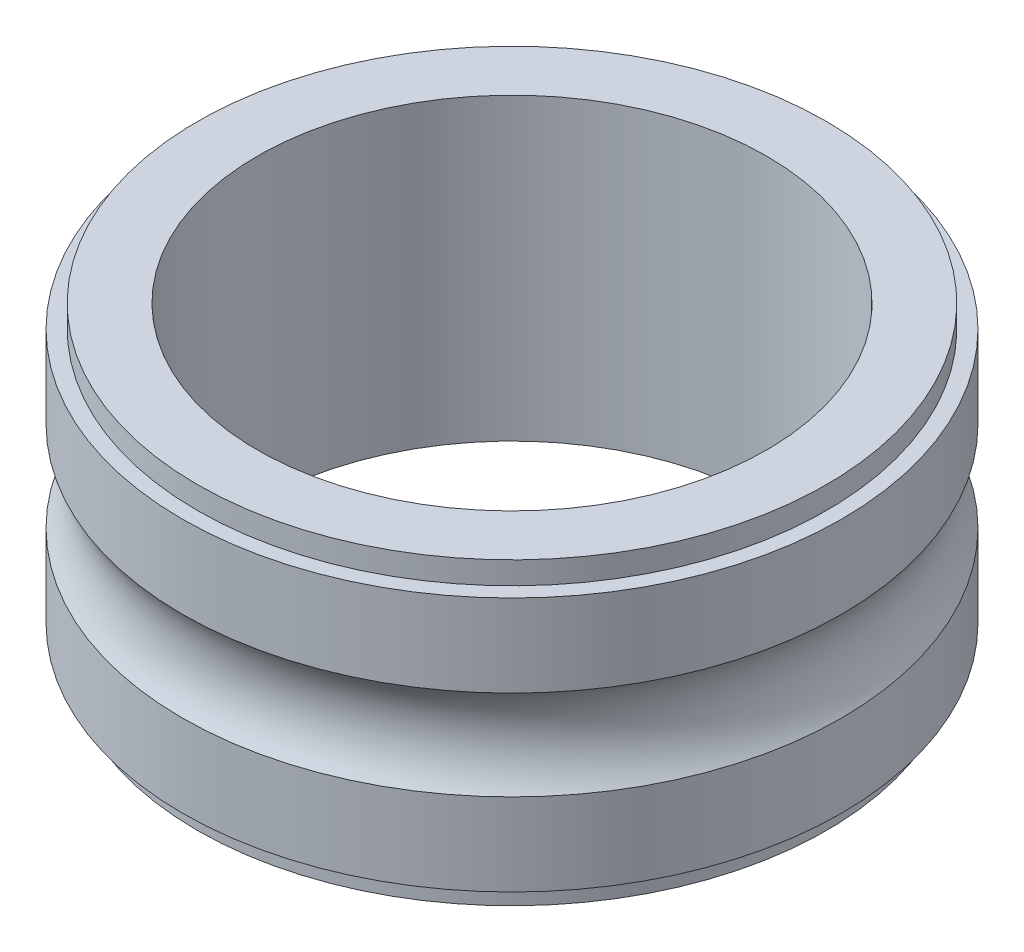
ISO-10303-21;
HEADER;
FILE_DESCRIPTION(('STEP AP214'),'2;1');
FILE_NAME('part.step','',(''),(''),'','','');
FILE_SCHEMA(('AUTOMOTIVE_DESIGN { 1 0 10303 214 1 1 1 1 }'));
ENDSEC;
DATA;
#1=APPLICATION_CONTEXT('core data for automotive mechanical design processes');
#2=APPLICATION_PROTOCOL_DEFINITION('international standard','automotive_design',2000,#1);
#3=PRODUCT_CONTEXT('',#1,'mechanical');
#4=PRODUCT('Part','Part','',(#3));
#5=PRODUCT_RELATED_PRODUCT_CATEGORY('part','',(#4));
#6=PRODUCT_DEFINITION_FORMATION('','',#4);
#7=PRODUCT_DEFINITION_CONTEXT('part definition',#1,'design');
#8=PRODUCT_DEFINITION('design','',#6,#7);
#9=PRODUCT_DEFINITION_SHAPE('','',#8);
#10=(LENGTH_UNIT() NAMED_UNIT(*) SI_UNIT(.MILLI.,.METRE.));
#11=(NAMED_UNIT(*) PLANE_ANGLE_UNIT() SI_UNIT($,.RADIAN.));
#12=(NAMED_UNIT(*) SI_UNIT($,.STERADIAN.) SOLID_ANGLE_UNIT());
#13=UNCERTAINTY_MEASURE_WITH_UNIT(LENGTH_MEASURE(1.E-05),#10,'distance_accuracy_value','');
#14=(GEOMETRIC_REPRESENTATION_CONTEXT(3) GLOBAL_UNCERTAINTY_ASSIGNED_CONTEXT((#13)) GLOBAL_UNIT_ASSIGNED_CONTEXT((#10,
#11,#12)) REPRESENTATION_CONTEXT('',''));
#15=CARTESIAN_POINT('',(0.,0.,0.));
#16=DIRECTION('',(0.,0.,1.));
#17=DIRECTION('',(1.,0.,0.));
#18=AXIS2_PLACEMENT_3D('',#15,#16,#17);
#19=CARTESIAN_POINT('',(0.,0.,0.));
#20=DIRECTION('',(0.,-1.,0.));
#21=DIRECTION('',(0.,0.,-1.));
#22=AXIS2_PLACEMENT_3D('',#19,#20,#21);
#23=CYLINDRICAL_SURFACE('',#22,8.5);
#24=CARTESIAN_POINT('',(0.,-5.,0.));
#25=DIRECTION('',(0.,-1.,0.));
#26=DIRECTION('',(0.,0.,-1.));
#27=AXIS2_PLACEMENT_3D('',#24,#25,#26);
#28=CIRCLE('',#27,8.5);
#29=CARTESIAN_POINT('',(0.,-5.,-8.5));
#30=VERTEX_POINT('',#29);
#31=EDGE_CURVE('E10',#30,#30,#28,.T.);
#32=ORIENTED_EDGE('',*,*,#31,.T.);
#33=EDGE_LOOP('',(#32));
#34=FACE_BOUND('',#33,.T.);
#35=CARTESIAN_POINT('',(0.,5.,0.));
#36=DIRECTION('',(0.,-1.,0.));
#37=DIRECTION('',(0.,0.,-1.));
#38=AXIS2_PLACEMENT_3D('',#35,#36,#37);
#39=CIRCLE('',#38,8.5);
#40=CARTESIAN_POINT('',(0.,5.,-8.5));
#41=VERTEX_POINT('',#40);
#42=EDGE_CURVE('E75',#41,#41,#39,.T.);
#43=ORIENTED_EDGE('',*,*,#42,.F.);
#44=EDGE_LOOP('',(#43));
#45=FACE_BOUND('',#44,.T.);
#46=ADVANCED_FACE('F41',(#34,#45),#23,.F.);
#47=CARTESIAN_POINT('',(8.5,-5.,0.));
#48=DIRECTION('',(0.,-1.,0.));
#49=DIRECTION('',(0.,0.,-1.));
#50=AXIS2_PLACEMENT_3D('',#47,#48,#49);
#51=PLANE('',#50);
#52=CARTESIAN_POINT('',(0.,-5.,0.));
#53=DIRECTION('',(0.,-1.,0.));
#54=DIRECTION('',(0.,0.,-1.));
#55=AXIS2_PLACEMENT_3D('',#52,#53,#54);
#56=CIRCLE('',#55,10.5);
#57=CARTESIAN_POINT('',(0.,-5.,-10.5));
#58=VERTEX_POINT('',#57);
#59=EDGE_CURVE('E47',#58,#58,#56,.T.);
#60=ORIENTED_EDGE('',*,*,#59,.T.);
#61=EDGE_LOOP('',(#60));
#62=FACE_BOUND('',#61,.T.);
#63=ORIENTED_EDGE('',*,*,#31,.F.);
#64=EDGE_LOOP('',(#63));
#65=FACE_BOUND('',#64,.T.);
#66=ADVANCED_FACE('F83',(#62,#65),#51,.T.);
#67=CARTESIAN_POINT('',(0.,0.,0.));
#68=DIRECTION('',(0.,-1.,0.));
#69=DIRECTION('',(0.,0.,-1.));
#70=AXIS2_PLACEMENT_3D('',#67,#68,#69);
#71=CYLINDRICAL_SURFACE('',#70,10.5);
#72=CARTESIAN_POINT('',(0.,-4.25,0.));
#73=DIRECTION('',(0.,-1.,0.));
#74=DIRECTION('',(0.,0.,-1.));
#75=AXIS2_PLACEMENT_3D('',#72,#73,#74);
#76=CIRCLE('',#75,10.5);
#77=CARTESIAN_POINT('',(0.,-4.25,-10.5));
#78=VERTEX_POINT('',#77);
#79=EDGE_CURVE('E51',#78,#78,#76,.T.);
#80=ORIENTED_EDGE('',*,*,#79,.T.);
#81=EDGE_LOOP('',(#80));
#82=FACE_BOUND('',#81,.T.);
#83=ORIENTED_EDGE('',*,*,#59,.F.);
#84=EDGE_LOOP('',(#83));
#85=FACE_BOUND('',#84,.T.);
#86=ADVANCED_FACE('F87',(#82,#85),#71,.T.);
#87=CARTESIAN_POINT('',(10.5,-4.25,0.));
#88=DIRECTION('',(0.,-1.,0.));
#89=DIRECTION('',(0.,0.,-1.));
#90=AXIS2_PLACEMENT_3D('',#87,#88,#89);
#91=PLANE('',#90);
#92=CARTESIAN_POINT('',(0.,-4.25,0.));
#93=DIRECTION('',(0.,-1.,0.));
#94=DIRECTION('',(0.,0.,-1.));
#95=AXIS2_PLACEMENT_3D('',#92,#93,#94);
#96=CIRCLE('',#95,11.);
#97=CARTESIAN_POINT('',(0.,-4.25,-11.));
#98=VERTEX_POINT('',#97);
#99=EDGE_CURVE('E55',#98,#98,#96,.T.);
#100=ORIENTED_EDGE('',*,*,#99,.T.);
#101=EDGE_LOOP('',(#100));
#102=FACE_BOUND('',#101,.T.);
#103=ORIENTED_EDGE('',*,*,#79,.F.);
#104=EDGE_LOOP('',(#103));
#105=FACE_BOUND('',#104,.T.);
#106=ADVANCED_FACE('F91',(#102,#105),#91,.T.);
#107=CARTESIAN_POINT('',(0.,0.,0.));
#108=DIRECTION('',(0.,-1.,0.));
#109=DIRECTION('',(0.,0.,-1.));
#110=AXIS2_PLACEMENT_3D('',#107,#108,#109);
#111=CYLINDRICAL_SURFACE('',#110,11.);
#112=CARTESIAN_POINT('',(0.,-1.5,0.));
#113=DIRECTION('',(0.,-1.,0.));
#114=DIRECTION('',(0.,0.,-1.));
#115=AXIS2_PLACEMENT_3D('',#112,#113,#114);
#116=CIRCLE('',#115,11.);
#117=CARTESIAN_POINT('',(0.,-1.5,-11.));
#118=VERTEX_POINT('',#117);
#119=EDGE_CURVE('E60',#118,#118,#116,.T.);
#120=ORIENTED_EDGE('',*,*,#119,.T.);
#121=EDGE_LOOP('',(#120));
#122=FACE_BOUND('',#121,.T.);
#123=ORIENTED_EDGE('',*,*,#99,.F.);
#124=EDGE_LOOP('',(#123));
#125=FACE_BOUND('',#124,.T.);
#126=ADVANCED_FACE('F98',(#122,#125),#111,.T.);
#127=CARTESIAN_POINT('',(0.,0.,0.));
#128=DIRECTION('',(0.,-1.,0.));
#129=DIRECTION('',(0.,0.,-1.));
#130=AXIS2_PLACEMENT_3D('',#127,#128,#129);
#131=TOROIDAL_SURFACE('',#130,13.,2.5);
#132=CARTESIAN_POINT('',(0.,1.5,0.));
#133=DIRECTION('',(0.,-1.,0.));
#134=DIRECTION('',(0.,0.,-1.));
#135=AXIS2_PLACEMENT_3D('',#132,#133,#134);
#136=CIRCLE('',#135,11.);
#137=CARTESIAN_POINT('',(0.,1.5,-11.));
#138=VERTEX_POINT('',#137);
#139=EDGE_CURVE('E63',#138,#138,#136,.T.);
#140=ORIENTED_EDGE('',*,*,#139,.T.);
#141=EDGE_LOOP('',(#140));
#142=FACE_BOUND('',#141,.T.);
#143=ORIENTED_EDGE('',*,*,#119,.F.);
#144=EDGE_LOOP('',(#143));
#145=FACE_BOUND('',#144,.T.);
#146=ADVANCED_FACE('F102',(#142,#145),#131,.F.);
#147=CARTESIAN_POINT('',(0.,0.,0.));
#148=DIRECTION('',(0.,-1.,0.));
#149=DIRECTION('',(0.,0.,-1.));
#150=AXIS2_PLACEMENT_3D('',#147,#148,#149);
#151=CYLINDRICAL_SURFACE('',#150,11.);
#152=CARTESIAN_POINT('',(0.,4.25,0.));
#153=DIRECTION('',(0.,-1.,0.));
#154=DIRECTION('',(0.,0.,-1.));
#155=AXIS2_PLACEMENT_3D('',#152,#153,#154);
#156=CIRCLE('',#155,11.);
#157=CARTESIAN_POINT('',(0.,4.25,-11.));
#158=VERTEX_POINT('',#157);
#159=EDGE_CURVE('E66',#158,#158,#156,.T.);
#160=ORIENTED_EDGE('',*,*,#159,.T.);
#161=EDGE_LOOP('',(#160));
#162=FACE_BOUND('',#161,.T.);
#163=ORIENTED_EDGE('',*,*,#139,.F.);
#164=EDGE_LOOP('',(#163));
#165=FACE_BOUND('',#164,.T.);
#166=ADVANCED_FACE('F106',(#162,#165),#151,.T.);
#167=CARTESIAN_POINT('',(10.5,4.25,0.));
#168=DIRECTION('',(0.,1.,0.));
#169=DIRECTION('',(0.,0.,1.));
#170=AXIS2_PLACEMENT_3D('',#167,#168,#169);
#171=PLANE('',#170);
#172=CARTESIAN_POINT('',(0.,4.25,0.));
#173=DIRECTION('',(0.,-1.,0.));
#174=DIRECTION('',(0.,0.,-1.));
#175=AXIS2_PLACEMENT_3D('',#172,#173,#174);
#176=CIRCLE('',#175,10.5);
#177=CARTESIAN_POINT('',(0.,4.25,-10.5));
#178=VERTEX_POINT('',#177);
#179=EDGE_CURVE('E69',#178,#178,#176,.T.);
#180=ORIENTED_EDGE('',*,*,#179,.T.);
#181=EDGE_LOOP('',(#180));
#182=FACE_BOUND('',#181,.T.);
#183=ORIENTED_EDGE('',*,*,#159,.F.);
#184=EDGE_LOOP('',(#183));
#185=FACE_BOUND('',#184,.T.);
#186=ADVANCED_FACE('F110',(#182,#185),#171,.T.);
#187=CARTESIAN_POINT('',(0.,0.,0.));
#188=DIRECTION('',(0.,-1.,0.));
#189=DIRECTION('',(0.,0.,-1.));
#190=AXIS2_PLACEMENT_3D('',#187,#188,#189);
#191=CYLINDRICAL_SURFACE('',#190,10.5);
#192=CARTESIAN_POINT('',(0.,5.,0.));
#193=DIRECTION('',(0.,-1.,0.));
#194=DIRECTION('',(0.,0.,-1.));
#195=AXIS2_PLACEMENT_3D('',#192,#193,#194);
#196=CIRCLE('',#195,10.5);
#197=CARTESIAN_POINT('',(0.,5.,-10.5));
#198=VERTEX_POINT('',#197);
#199=EDGE_CURVE('E72',#198,#198,#196,.T.);
#200=ORIENTED_EDGE('',*,*,#199,.T.);
#201=EDGE_LOOP('',(#200));
#202=FACE_BOUND('',#201,.T.);
#203=ORIENTED_EDGE('',*,*,#179,.F.);
#204=EDGE_LOOP('',(#203));
#205=FACE_BOUND('',#204,.T.);
#206=ADVANCED_FACE('F114',(#202,#205),#191,.T.);
#207=CARTESIAN_POINT('',(8.5,5.,0.));
#208=DIRECTION('',(0.,1.,0.));
#209=DIRECTION('',(0.,0.,1.));
#210=AXIS2_PLACEMENT_3D('',#207,#208,#209);
#211=PLANE('',#210);
#212=ORIENTED_EDGE('',*,*,#42,.T.);
#213=EDGE_LOOP('',(#212));
#214=FACE_BOUND('',#213,.T.);
#215=ORIENTED_EDGE('',*,*,#199,.F.);
#216=EDGE_LOOP('',(#215));
#217=FACE_BOUND('',#216,.T.);
#218=ADVANCED_FACE('F79',(#214,#217),#211,.T.);
#219=CLOSED_SHELL('',(#46,#66,#86,#106,#126,#146,#166,#186,#206,#218));
#220=MANIFOLD_SOLID_BREP('B2',#219);
#221=ADVANCED_BREP_SHAPE_REPRESENTATION('',(#18,#220),#14);
#222=SHAPE_DEFINITION_REPRESENTATION(#9,#221);
ENDSEC;
END-ISO-10303-21;
